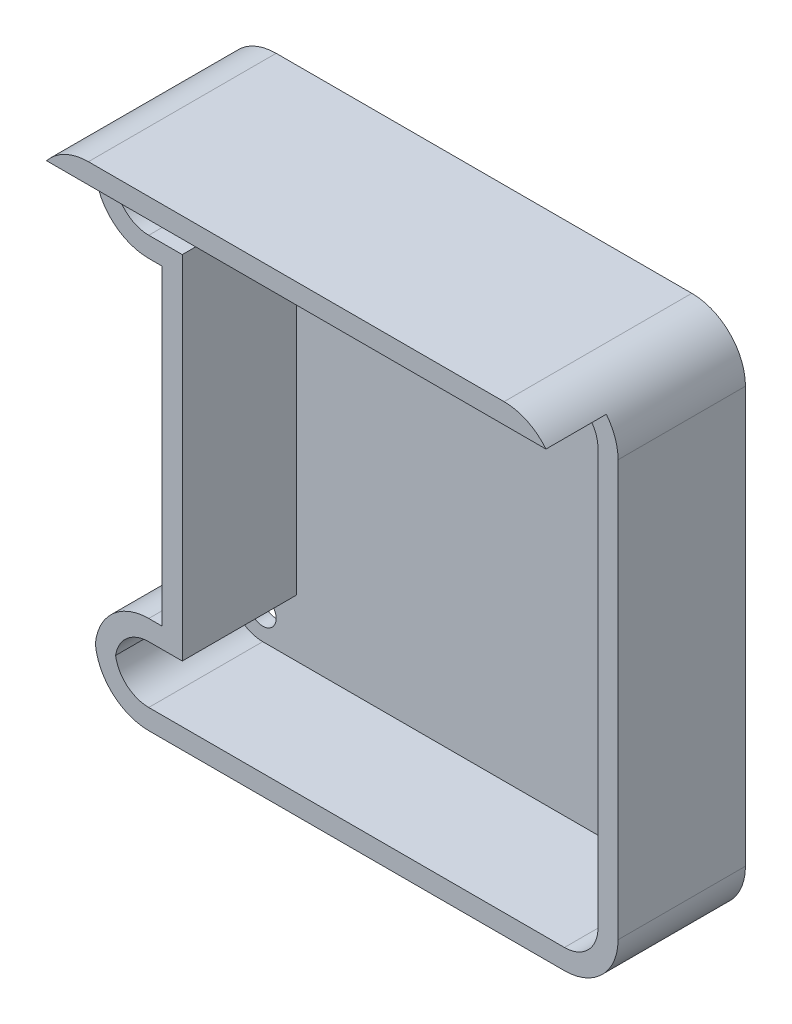
ISO-10303-21;
HEADER;
FILE_DESCRIPTION(('STEP AP214'),'2;1');
FILE_NAME('part.step','',(''),(''),'','','');
FILE_SCHEMA(('AUTOMOTIVE_DESIGN { 1 0 10303 214 1 1 1 1 }'));
ENDSEC;
DATA;
#1=APPLICATION_CONTEXT('core data for automotive mechanical design processes');
#2=APPLICATION_PROTOCOL_DEFINITION('international standard','automotive_design',2000,#1);
#3=PRODUCT_CONTEXT('',#1,'mechanical');
#4=PRODUCT('Part','Part','',(#3));
#5=PRODUCT_RELATED_PRODUCT_CATEGORY('part','',(#4));
#6=PRODUCT_DEFINITION_FORMATION('','',#4);
#7=PRODUCT_DEFINITION_CONTEXT('part definition',#1,'design');
#8=PRODUCT_DEFINITION('design','',#6,#7);
#9=PRODUCT_DEFINITION_SHAPE('','',#8);
#10=(LENGTH_UNIT() NAMED_UNIT(*) SI_UNIT(.MILLI.,.METRE.));
#11=(NAMED_UNIT(*) PLANE_ANGLE_UNIT() SI_UNIT($,.RADIAN.));
#12=(NAMED_UNIT(*) SI_UNIT($,.STERADIAN.) SOLID_ANGLE_UNIT());
#13=UNCERTAINTY_MEASURE_WITH_UNIT(LENGTH_MEASURE(1.E-05),#10,'distance_accuracy_value','');
#14=(GEOMETRIC_REPRESENTATION_CONTEXT(3) GLOBAL_UNCERTAINTY_ASSIGNED_CONTEXT((#13)) GLOBAL_UNIT_ASSIGNED_CONTEXT((#10,
#11,#12)) REPRESENTATION_CONTEXT('',''));
#15=CARTESIAN_POINT('',(0.,0.,0.));
#16=DIRECTION('',(0.,0.,1.));
#17=DIRECTION('',(1.,0.,0.));
#18=AXIS2_PLACEMENT_3D('',#15,#16,#17);
#19=CARTESIAN_POINT('',(-78.,0.,19.));
#20=DIRECTION('',(-1.,0.,0.));
#21=DIRECTION('',(0.,0.,1.));
#22=AXIS2_PLACEMENT_3D('',#19,#20,#21);
#23=PLANE('',#22);
#24=DIRECTION('',(0.,1.,0.));
#25=VECTOR('',#24,1.);
#26=CARTESIAN_POINT('',(-78.,0.,0.));
#27=LINE('',#26,#25);
#28=CARTESIAN_POINT('',(-78.,69.,0.));
#29=VERTEX_POINT('',#28);
#30=CARTESIAN_POINT('',(-78.,70.,0.));
#31=VERTEX_POINT('',#30);
#32=EDGE_CURVE('E465',#29,#31,#27,.T.);
#33=ORIENTED_EDGE('',*,*,#32,.F.);
#34=DIRECTION('',(0.,0.,-1.));
#35=VECTOR('',#34,1.);
#36=CARTESIAN_POINT('',(-78.,69.,19.));
#37=LINE('',#36,#35);
#38=CARTESIAN_POINT('',(-78.,69.,19.));
#39=VERTEX_POINT('',#38);
#40=EDGE_CURVE('E386',#29,#39,#37,.F.);
#41=ORIENTED_EDGE('',*,*,#40,.T.);
#42=DIRECTION('',(0.,1.,0.));
#43=VECTOR('',#42,1.);
#44=CARTESIAN_POINT('',(-78.,0.,19.));
#45=LINE('',#44,#43);
#46=CARTESIAN_POINT('',(-78.,70.,19.));
#47=VERTEX_POINT('',#46);
#48=EDGE_CURVE('E484',#39,#47,#45,.T.);
#49=ORIENTED_EDGE('',*,*,#48,.T.);
#50=DIRECTION('',(0.,0.,-1.));
#51=VECTOR('',#50,1.);
#52=CARTESIAN_POINT('',(-78.,70.,0.));
#53=LINE('',#52,#51);
#54=EDGE_CURVE('E382',#47,#31,#53,.T.);
#55=ORIENTED_EDGE('',*,*,#54,.T.);
#56=EDGE_LOOP('',(#33,#41,#49,#55));
#57=FACE_BOUND('',#56,.T.);
#58=ADVANCED_FACE('F41',(#57),#23,.T.);
#59=CARTESIAN_POINT('',(0.,61.,19.));
#60=DIRECTION('',(0.,1.,0.));
#61=DIRECTION('',(0.,0.,1.));
#62=AXIS2_PLACEMENT_3D('',#59,#60,#61);
#63=PLANE('',#62);
#64=DIRECTION('',(1.,0.,0.));
#65=VECTOR('',#64,1.);
#66=CARTESIAN_POINT('',(0.,61.,19.));
#67=LINE('',#66,#65);
#68=CARTESIAN_POINT('',(-70.,61.,19.));
#69=VERTEX_POINT('',#68);
#70=CARTESIAN_POINT('',(-68.,61.,19.));
#71=VERTEX_POINT('',#70);
#72=EDGE_CURVE('E489',#69,#71,#67,.T.);
#73=ORIENTED_EDGE('',*,*,#72,.F.);
#74=DIRECTION('',(0.,0.,-1.));
#75=VECTOR('',#74,1.);
#76=CARTESIAN_POINT('',(-70.,61.,0.));
#77=LINE('',#76,#75);
#78=CARTESIAN_POINT('',(-70.,61.,0.));
#79=VERTEX_POINT('',#78);
#80=EDGE_CURVE('E378',#69,#79,#77,.T.);
#81=ORIENTED_EDGE('',*,*,#80,.T.);
#82=DIRECTION('',(1.,0.,0.));
#83=VECTOR('',#82,1.);
#84=CARTESIAN_POINT('',(0.,61.,0.));
#85=LINE('',#84,#83);
#86=CARTESIAN_POINT('',(-68.,61.,0.));
#87=VERTEX_POINT('',#86);
#88=EDGE_CURVE('E526',#79,#87,#85,.T.);
#89=ORIENTED_EDGE('',*,*,#88,.T.);
#90=DIRECTION('',(0.,0.,-1.));
#91=VECTOR('',#90,1.);
#92=CARTESIAN_POINT('',(-68.,61.,19.));
#93=LINE('',#92,#91);
#94=EDGE_CURVE('E270',#71,#87,#93,.T.);
#95=ORIENTED_EDGE('',*,*,#94,.F.);
#96=EDGE_LOOP('',(#73,#81,#89,#95));
#97=FACE_BOUND('',#96,.T.);
#98=ADVANCED_FACE('F594',(#97),#63,.F.);
#99=CARTESIAN_POINT('',(-68.,0.,19.));
#100=DIRECTION('',(1.,0.,0.));
#101=DIRECTION('',(0.,0.,-1.));
#102=AXIS2_PLACEMENT_3D('',#99,#100,#101);
#103=PLANE('',#102);
#104=DIRECTION('',(0.,-1.,0.));
#105=VECTOR('',#104,1.);
#106=CARTESIAN_POINT('',(-68.,0.,0.));
#107=LINE('',#106,#105);
#108=CARTESIAN_POINT('',(-68.,14.5,0.));
#109=VERTEX_POINT('',#108);
#110=EDGE_CURVE('E529',#87,#109,#107,.T.);
#111=ORIENTED_EDGE('',*,*,#110,.T.);
#112=DIRECTION('',(0.,0.,-1.));
#113=VECTOR('',#112,1.);
#114=CARTESIAN_POINT('',(-68.,14.5,19.));
#115=LINE('',#114,#113);
#116=CARTESIAN_POINT('',(-68.,14.5,19.));
#117=VERTEX_POINT('',#116);
#118=EDGE_CURVE('E260',#117,#109,#115,.T.);
#119=ORIENTED_EDGE('',*,*,#118,.F.);
#120=DIRECTION('',(0.,-1.,0.));
#121=VECTOR('',#120,1.);
#122=CARTESIAN_POINT('',(-68.,0.,19.));
#123=LINE('',#122,#121);
#124=EDGE_CURVE('E492',#71,#117,#123,.T.);
#125=ORIENTED_EDGE('',*,*,#124,.F.);
#126=ORIENTED_EDGE('',*,*,#94,.T.);
#127=EDGE_LOOP('',(#111,#119,#125,#126));
#128=FACE_BOUND('',#127,.T.);
#129=ADVANCED_FACE('F600',(#128),#103,.F.);
#130=CARTESIAN_POINT('',(0.,14.5,19.));
#131=DIRECTION('',(0.,-1.,0.));
#132=DIRECTION('',(1.,0.,0.));
#133=AXIS2_PLACEMENT_3D('',#130,#131,#132);
#134=PLANE('',#133);
#135=DIRECTION('',(-1.,0.,0.));
#136=VECTOR('',#135,1.);
#137=CARTESIAN_POINT('',(0.,14.5,0.));
#138=LINE('',#137,#136);
#139=CARTESIAN_POINT('',(-70.,14.5,0.));
#140=VERTEX_POINT('',#139);
#141=EDGE_CURVE('E532',#109,#140,#138,.T.);
#142=ORIENTED_EDGE('',*,*,#141,.T.);
#143=DIRECTION('',(0.,0.,-1.));
#144=VECTOR('',#143,1.);
#145=CARTESIAN_POINT('',(-70.,14.5,19.));
#146=LINE('',#145,#144);
#147=CARTESIAN_POINT('',(-70.,14.5,19.));
#148=VERTEX_POINT('',#147);
#149=EDGE_CURVE('E375',#140,#148,#146,.F.);
#150=ORIENTED_EDGE('',*,*,#149,.T.);
#151=DIRECTION('',(-1.,0.,0.));
#152=VECTOR('',#151,1.);
#153=CARTESIAN_POINT('',(0.,14.5,19.));
#154=LINE('',#153,#152);
#155=EDGE_CURVE('E495',#117,#148,#154,.T.);
#156=ORIENTED_EDGE('',*,*,#155,.F.);
#157=ORIENTED_EDGE('',*,*,#118,.T.);
#158=EDGE_LOOP('',(#142,#150,#156,#157));
#159=FACE_BOUND('',#158,.T.);
#160=ADVANCED_FACE('F608',(#159),#134,.F.);
#161=CARTESIAN_POINT('',(0.,0.,19.));
#162=DIRECTION('',(0.,-1.,0.));
#163=DIRECTION('',(1.,0.,0.));
#164=AXIS2_PLACEMENT_3D('',#161,#162,#163);
#165=PLANE('',#164);
#166=DIRECTION('',(-1.,0.,0.));
#167=VECTOR('',#166,1.);
#168=CARTESIAN_POINT('',(0.,0.,0.));
#169=LINE('',#168,#167);
#170=CARTESIAN_POINT('',(-8.,0.,0.));
#171=VERTEX_POINT('',#170);
#172=CARTESIAN_POINT('',(-70.,0.,0.));
#173=VERTEX_POINT('',#172);
#174=EDGE_CURVE('E535',#171,#173,#169,.T.);
#175=ORIENTED_EDGE('',*,*,#174,.F.);
#176=DIRECTION('',(0.,0.,-1.));
#177=VECTOR('',#176,1.);
#178=CARTESIAN_POINT('',(-8.,0.,19.));
#179=LINE('',#178,#177);
#180=CARTESIAN_POINT('',(-8.,0.,19.));
#181=VERTEX_POINT('',#180);
#182=EDGE_CURVE('E354',#171,#181,#179,.F.);
#183=ORIENTED_EDGE('',*,*,#182,.T.);
#184=DIRECTION('',(-1.,0.,0.));
#185=VECTOR('',#184,1.);
#186=CARTESIAN_POINT('',(0.,0.,19.));
#187=LINE('',#186,#185);
#188=CARTESIAN_POINT('',(-70.,0.,19.));
#189=VERTEX_POINT('',#188);
#190=EDGE_CURVE('E499',#181,#189,#187,.T.);
#191=ORIENTED_EDGE('',*,*,#190,.T.);
#192=DIRECTION('',(0.,0.,-1.));
#193=VECTOR('',#192,1.);
#194=CARTESIAN_POINT('',(-70.,0.,19.));
#195=LINE('',#194,#193);
#196=EDGE_CURVE('E350',#189,#173,#195,.T.);
#197=ORIENTED_EDGE('',*,*,#196,.T.);
#198=EDGE_LOOP('',(#175,#183,#191,#197));
#199=FACE_BOUND('',#198,.T.);
#200=ADVANCED_FACE('F606',(#199),#165,.T.);
#201=CARTESIAN_POINT('',(0.,0.,19.));
#202=DIRECTION('',(-1.,0.,0.));
#203=DIRECTION('',(0.,0.,1.));
#204=AXIS2_PLACEMENT_3D('',#201,#202,#203);
#205=PLANE('',#204);
#206=DIRECTION('',(0.,1.,0.));
#207=VECTOR('',#206,1.);
#208=CARTESIAN_POINT('',(0.,0.,19.));
#209=LINE('',#208,#207);
#210=CARTESIAN_POINT('',(0.,8.,19.));
#211=VERTEX_POINT('',#210);
#212=CARTESIAN_POINT('',(0.,70.,19.));
#213=VERTEX_POINT('',#212);
#214=EDGE_CURVE('E503',#211,#213,#209,.T.);
#215=ORIENTED_EDGE('',*,*,#214,.F.);
#216=DIRECTION('',(0.,0.,-1.));
#217=VECTOR('',#216,1.);
#218=CARTESIAN_POINT('',(0.,8.,0.));
#219=LINE('',#218,#217);
#220=CARTESIAN_POINT('',(0.,8.,0.));
#221=VERTEX_POINT('',#220);
#222=EDGE_CURVE('E328',#211,#221,#219,.T.);
#223=ORIENTED_EDGE('',*,*,#222,.T.);
#224=DIRECTION('',(0.,1.,0.));
#225=VECTOR('',#224,1.);
#226=CARTESIAN_POINT('',(0.,0.,0.));
#227=LINE('',#226,#225);
#228=CARTESIAN_POINT('',(0.,70.,0.));
#229=VERTEX_POINT('',#228);
#230=EDGE_CURVE('E264',#221,#229,#227,.T.);
#231=ORIENTED_EDGE('',*,*,#230,.T.);
#232=DIRECTION('',(0.,0.,-1.));
#233=VECTOR('',#232,1.);
#234=CARTESIAN_POINT('',(0.,70.,19.));
#235=LINE('',#234,#233);
#236=EDGE_CURVE('E319',#229,#213,#235,.F.);
#237=ORIENTED_EDGE('',*,*,#236,.T.);
#238=EDGE_LOOP('',(#215,#223,#231,#237));
#239=FACE_BOUND('',#238,.T.);
#240=ADVANCED_FACE('F546',(#239),#205,.F.);
#241=CARTESIAN_POINT('',(-3.,0.,19.));
#242=DIRECTION('',(-1.,0.,0.));
#243=DIRECTION('',(0.,-1.,0.));
#244=AXIS2_PLACEMENT_3D('',#241,#242,#243);
#245=PLANE('',#244);
#246=DIRECTION('',(0.,1.,0.));
#247=VECTOR('',#246,1.);
#248=CARTESIAN_POINT('',(-3.,0.,19.));
#249=LINE('',#248,#247);
#250=CARTESIAN_POINT('',(-3.,7.99999999999999,19.));
#251=VERTEX_POINT('',#250);
#252=CARTESIAN_POINT('',(-3.,70.,19.));
#253=VERTEX_POINT('',#252);
#254=EDGE_CURVE('E507',#251,#253,#249,.T.);
#255=ORIENTED_EDGE('',*,*,#254,.T.);
#256=DIRECTION('',(0.,0.,-1.));
#257=VECTOR('',#256,1.);
#258=CARTESIAN_POINT('',(-3.,70.,19.));
#259=LINE('',#258,#257);
#260=CARTESIAN_POINT('',(-3.,70.,2.));
#261=VERTEX_POINT('',#260);
#262=EDGE_CURVE('E429',#253,#261,#259,.T.);
#263=ORIENTED_EDGE('',*,*,#262,.T.);
#264=DIRECTION('',(0.,1.,0.));
#265=VECTOR('',#264,1.);
#266=CARTESIAN_POINT('',(-3.,0.,2.));
#267=LINE('',#266,#265);
#268=CARTESIAN_POINT('',(-3.,7.99999999999999,2.));
#269=VERTEX_POINT('',#268);
#270=EDGE_CURVE('E450',#269,#261,#267,.T.);
#271=ORIENTED_EDGE('',*,*,#270,.F.);
#272=DIRECTION('',(0.,0.,-1.));
#273=VECTOR('',#272,1.);
#274=CARTESIAN_POINT('',(-3.,7.99999999999999,19.));
#275=LINE('',#274,#273);
#276=EDGE_CURVE('E303',#269,#251,#275,.F.);
#277=ORIENTED_EDGE('',*,*,#276,.T.);
#278=EDGE_LOOP('',(#255,#263,#271,#277));
#279=FACE_BOUND('',#278,.T.);
#280=ADVANCED_FACE('F562',(#279),#245,.T.);
#281=CARTESIAN_POINT('',(0.,2.99999999999999,19.));
#282=DIRECTION('',(0.,1.,0.));
#283=DIRECTION('',(0.,0.,1.));
#284=AXIS2_PLACEMENT_3D('',#281,#282,#283);
#285=PLANE('',#284);
#286=DIRECTION('',(1.,0.,0.));
#287=VECTOR('',#286,1.);
#288=CARTESIAN_POINT('',(0.,2.99999999999999,2.));
#289=LINE('',#288,#287);
#290=CARTESIAN_POINT('',(-70.,2.99999999999999,2.));
#291=VERTEX_POINT('',#290);
#292=CARTESIAN_POINT('',(-8.,2.99999999999999,2.));
#293=VERTEX_POINT('',#292);
#294=EDGE_CURVE('E461',#291,#293,#289,.T.);
#295=ORIENTED_EDGE('',*,*,#294,.F.);
#296=DIRECTION('',(0.,0.,-1.));
#297=VECTOR('',#296,1.);
#298=CARTESIAN_POINT('',(-70.,2.99999999999999,19.));
#299=LINE('',#298,#297);
#300=CARTESIAN_POINT('',(-70.,2.99999999999999,19.));
#301=VERTEX_POINT('',#300);
#302=EDGE_CURVE('E300',#291,#301,#299,.F.);
#303=ORIENTED_EDGE('',*,*,#302,.T.);
#304=DIRECTION('',(1.,0.,0.));
#305=VECTOR('',#304,1.);
#306=CARTESIAN_POINT('',(0.,2.99999999999999,19.));
#307=LINE('',#306,#305);
#308=CARTESIAN_POINT('',(-8.,2.99999999999999,19.));
#309=VERTEX_POINT('',#308);
#310=EDGE_CURVE('E510',#301,#309,#307,.T.);
#311=ORIENTED_EDGE('',*,*,#310,.T.);
#312=DIRECTION('',(0.,0.,-1.));
#313=VECTOR('',#312,1.);
#314=CARTESIAN_POINT('',(-8.,2.99999999999999,2.));
#315=LINE('',#314,#313);
#316=EDGE_CURVE('E296',#309,#293,#315,.T.);
#317=ORIENTED_EDGE('',*,*,#316,.T.);
#318=EDGE_LOOP('',(#295,#303,#311,#317));
#319=FACE_BOUND('',#318,.T.);
#320=ADVANCED_FACE('F570',(#319),#285,.T.);
#321=CARTESIAN_POINT('',(0.,11.5,19.));
#322=DIRECTION('',(0.,-1.,0.));
#323=DIRECTION('',(1.,0.,0.));
#324=AXIS2_PLACEMENT_3D('',#321,#322,#323);
#325=PLANE('',#324);
#326=DIRECTION('',(-1.,0.,0.));
#327=VECTOR('',#326,1.);
#328=CARTESIAN_POINT('',(0.,11.5,19.));
#329=LINE('',#328,#327);
#330=CARTESIAN_POINT('',(-65.,11.5,19.));
#331=VERTEX_POINT('',#330);
#332=CARTESIAN_POINT('',(-70.,11.5,19.));
#333=VERTEX_POINT('',#332);
#334=EDGE_CURVE('E514',#331,#333,#329,.T.);
#335=ORIENTED_EDGE('',*,*,#334,.T.);
#336=DIRECTION('',(0.,0.,-1.));
#337=VECTOR('',#336,1.);
#338=CARTESIAN_POINT('',(-70.,11.5,2.));
#339=LINE('',#338,#337);
#340=CARTESIAN_POINT('',(-70.,11.5,2.));
#341=VERTEX_POINT('',#340);
#342=EDGE_CURVE('E292',#333,#341,#339,.T.);
#343=ORIENTED_EDGE('',*,*,#342,.T.);
#344=DIRECTION('',(-1.,0.,0.));
#345=VECTOR('',#344,1.);
#346=CARTESIAN_POINT('',(0.,11.5,2.));
#347=LINE('',#346,#345);
#348=CARTESIAN_POINT('',(-65.,11.5,2.));
#349=VERTEX_POINT('',#348);
#350=EDGE_CURVE('E250',#349,#341,#347,.T.);
#351=ORIENTED_EDGE('',*,*,#350,.F.);
#352=DIRECTION('',(0.,0.,-1.));
#353=VECTOR('',#352,1.);
#354=CARTESIAN_POINT('',(-65.,11.5,19.));
#355=LINE('',#354,#353);
#356=EDGE_CURVE('E248',#331,#349,#355,.T.);
#357=ORIENTED_EDGE('',*,*,#356,.F.);
#358=EDGE_LOOP('',(#335,#343,#351,#357));
#359=FACE_BOUND('',#358,.T.);
#360=ADVANCED_FACE('F584',(#359),#325,.T.);
#361=CARTESIAN_POINT('',(-65.,0.,19.));
#362=DIRECTION('',(1.,0.,0.));
#363=DIRECTION('',(0.,0.,-1.));
#364=AXIS2_PLACEMENT_3D('',#361,#362,#363);
#365=PLANE('',#364);
#366=DIRECTION('',(0.,-1.,0.));
#367=VECTOR('',#366,1.);
#368=CARTESIAN_POINT('',(-65.,0.,2.));
#369=LINE('',#368,#367);
#370=CARTESIAN_POINT('',(-65.,64.,2.));
#371=VERTEX_POINT('',#370);
#372=EDGE_CURVE('E231',#371,#349,#369,.T.);
#373=ORIENTED_EDGE('',*,*,#372,.F.);
#374=DIRECTION('',(0.,0.,-1.));
#375=VECTOR('',#374,1.);
#376=CARTESIAN_POINT('',(-65.,64.,19.));
#377=LINE('',#376,#375);
#378=CARTESIAN_POINT('',(-65.,64.,19.));
#379=VERTEX_POINT('',#378);
#380=EDGE_CURVE('E246',#379,#371,#377,.T.);
#381=ORIENTED_EDGE('',*,*,#380,.F.);
#382=DIRECTION('',(0.,-1.,0.));
#383=VECTOR('',#382,1.);
#384=CARTESIAN_POINT('',(-65.,0.,19.));
#385=LINE('',#384,#383);
#386=EDGE_CURVE('E518',#379,#331,#385,.T.);
#387=ORIENTED_EDGE('',*,*,#386,.T.);
#388=ORIENTED_EDGE('',*,*,#356,.T.);
#389=EDGE_LOOP('',(#373,#381,#387,#388));
#390=FACE_BOUND('',#389,.T.);
#391=ADVANCED_FACE('F244',(#390),#365,.T.);
#392=CARTESIAN_POINT('',(0.,64.,19.));
#393=DIRECTION('',(0.,1.,0.));
#394=DIRECTION('',(0.,0.,1.));
#395=AXIS2_PLACEMENT_3D('',#392,#393,#394);
#396=PLANE('',#395);
#397=DIRECTION('',(1.,0.,0.));
#398=VECTOR('',#397,1.);
#399=CARTESIAN_POINT('',(0.,64.,2.));
#400=LINE('',#399,#398);
#401=CARTESIAN_POINT('',(-70.,64.,2.));
#402=VERTEX_POINT('',#401);
#403=EDGE_CURVE('E226',#402,#371,#400,.T.);
#404=ORIENTED_EDGE('',*,*,#403,.F.);
#405=DIRECTION('',(0.,0.,-1.));
#406=VECTOR('',#405,1.);
#407=CARTESIAN_POINT('',(-70.,64.,19.));
#408=LINE('',#407,#406);
#409=CARTESIAN_POINT('',(-70.,64.,19.));
#410=VERTEX_POINT('',#409);
#411=EDGE_CURVE('E289',#402,#410,#408,.F.);
#412=ORIENTED_EDGE('',*,*,#411,.T.);
#413=DIRECTION('',(1.,0.,0.));
#414=VECTOR('',#413,1.);
#415=CARTESIAN_POINT('',(0.,64.,19.));
#416=LINE('',#415,#414);
#417=EDGE_CURVE('E254',#410,#379,#416,.T.);
#418=ORIENTED_EDGE('',*,*,#417,.T.);
#419=ORIENTED_EDGE('',*,*,#380,.T.);
#420=EDGE_LOOP('',(#404,#412,#418,#419));
#421=FACE_BOUND('',#420,.T.);
#422=ADVANCED_FACE('F252',(#421),#396,.T.);
#423=CARTESIAN_POINT('',(-75.,0.,19.));
#424=DIRECTION('',(1.,0.,0.));
#425=DIRECTION('',(0.,0.,-1.));
#426=AXIS2_PLACEMENT_3D('',#423,#424,#425);
#427=PLANE('',#426);
#428=DIRECTION('',(0.,-1.,0.));
#429=VECTOR('',#428,1.);
#430=CARTESIAN_POINT('',(-75.,0.,2.));
#431=LINE('',#430,#429);
#432=CARTESIAN_POINT('',(-75.,70.,2.));
#433=VERTEX_POINT('',#432);
#434=CARTESIAN_POINT('',(-75.,69.,2.));
#435=VERTEX_POINT('',#434);
#436=EDGE_CURVE('E239',#433,#435,#431,.T.);
#437=ORIENTED_EDGE('',*,*,#436,.F.);
#438=DIRECTION('',(0.,0.,-1.));
#439=VECTOR('',#438,1.);
#440=CARTESIAN_POINT('',(-75.,70.,19.));
#441=LINE('',#440,#439);
#442=CARTESIAN_POINT('',(-75.,70.,19.));
#443=VERTEX_POINT('',#442);
#444=EDGE_CURVE('E63',#433,#443,#441,.F.);
#445=ORIENTED_EDGE('',*,*,#444,.T.);
#446=DIRECTION('',(0.,-1.,0.));
#447=VECTOR('',#446,1.);
#448=CARTESIAN_POINT('',(-75.,0.,19.));
#449=LINE('',#448,#447);
#450=CARTESIAN_POINT('',(-75.,69.,19.));
#451=VERTEX_POINT('',#450);
#452=EDGE_CURVE('E256',#443,#451,#449,.T.);
#453=ORIENTED_EDGE('',*,*,#452,.T.);
#454=DIRECTION('',(0.,0.,-1.));
#455=VECTOR('',#454,1.);
#456=CARTESIAN_POINT('',(-75.,69.,2.));
#457=LINE('',#456,#455);
#458=EDGE_CURVE('E274',#451,#435,#457,.T.);
#459=ORIENTED_EDGE('',*,*,#458,.T.);
#460=EDGE_LOOP('',(#437,#445,#453,#459));
#461=FACE_BOUND('',#460,.T.);
#462=ADVANCED_FACE('F693',(#461),#427,.T.);
#463=CARTESIAN_POINT('',(0.,0.,19.));
#464=DIRECTION('',(0.,0.,1.));
#465=DIRECTION('',(1.,0.,0.));
#466=AXIS2_PLACEMENT_3D('',#463,#464,#465);
#467=PLANE('',#466);
#468=ORIENTED_EDGE('',*,*,#190,.F.);
#469=CARTESIAN_POINT('',(-8.,8.,19.));
#470=DIRECTION('',(0.,0.,1.));
#471=DIRECTION('',(1.,0.,0.));
#472=AXIS2_PLACEMENT_3D('',#469,#470,#471);
#473=CIRCLE('',#472,8.);
#474=EDGE_CURVE('E372',#181,#211,#473,.T.);
#475=ORIENTED_EDGE('',*,*,#474,.T.);
#476=ORIENTED_EDGE('',*,*,#214,.T.);
#477=CARTESIAN_POINT('',(-8.,70.,19.));
#478=DIRECTION('',(0.,0.,1.));
#479=DIRECTION('',(1.,0.,0.));
#480=AXIS2_PLACEMENT_3D('',#477,#478,#479);
#481=CIRCLE('',#480,8.);
#482=CARTESIAN_POINT('',(-1.75500200160159,75.,19.));
#483=VERTEX_POINT('',#482);
#484=EDGE_CURVE('E357',#213,#483,#481,.T.);
#485=ORIENTED_EDGE('',*,*,#484,.T.);
#486=DIRECTION('',(1.,0.,0.));
#487=VECTOR('',#486,1.);
#488=CARTESIAN_POINT('',(0.,75.,19.));
#489=LINE('',#488,#487);
#490=CARTESIAN_POINT('',(-8.,75.,19.));
#491=VERTEX_POINT('',#490);
#492=EDGE_CURVE('E485',#491,#483,#489,.T.);
#493=ORIENTED_EDGE('',*,*,#492,.F.);
#494=CARTESIAN_POINT('',(-8.,70.,19.));
#495=DIRECTION('',(0.,0.,1.));
#496=DIRECTION('',(1.,0.,0.));
#497=AXIS2_PLACEMENT_3D('',#494,#495,#496);
#498=CIRCLE('',#497,5.);
#499=EDGE_CURVE('E11',#491,#253,#498,.F.);
#500=ORIENTED_EDGE('',*,*,#499,.T.);
#501=ORIENTED_EDGE('',*,*,#254,.F.);
#502=CARTESIAN_POINT('',(-8.,7.99999999999999,19.));
#503=DIRECTION('',(0.,0.,1.));
#504=DIRECTION('',(1.,0.,0.));
#505=AXIS2_PLACEMENT_3D('',#502,#503,#504);
#506=CIRCLE('',#505,5.);
#507=EDGE_CURVE('E316',#251,#309,#506,.F.);
#508=ORIENTED_EDGE('',*,*,#507,.T.);
#509=ORIENTED_EDGE('',*,*,#310,.F.);
#510=CARTESIAN_POINT('',(-70.,7.99999999999999,19.));
#511=DIRECTION('',(0.,0.,1.));
#512=DIRECTION('',(1.,0.,0.));
#513=AXIS2_PLACEMENT_3D('',#510,#511,#512);
#514=CIRCLE('',#513,5.);
#515=CARTESIAN_POINT('',(-74.9434299833213,7.24999999999999,19.));
#516=VERTEX_POINT('',#515);
#517=EDGE_CURVE('E313',#301,#516,#514,.F.);
#518=ORIENTED_EDGE('',*,*,#517,.T.);
#519=CARTESIAN_POINT('',(-70.,6.49999999999999,19.));
#520=DIRECTION('',(0.,0.,1.));
#521=DIRECTION('',(1.,0.,0.));
#522=AXIS2_PLACEMENT_3D('',#519,#520,#521);
#523=CIRCLE('',#522,5.);
#524=EDGE_CURVE('E310',#516,#333,#523,.F.);
#525=ORIENTED_EDGE('',*,*,#524,.T.);
#526=ORIENTED_EDGE('',*,*,#334,.F.);
#527=ORIENTED_EDGE('',*,*,#386,.F.);
#528=ORIENTED_EDGE('',*,*,#417,.F.);
#529=CARTESIAN_POINT('',(-70.,69.,19.));
#530=DIRECTION('',(0.,0.,1.));
#531=DIRECTION('',(1.,0.,0.));
#532=AXIS2_PLACEMENT_3D('',#529,#530,#531);
#533=CIRCLE('',#532,5.);
#534=EDGE_CURVE('E306',#410,#451,#533,.F.);
#535=ORIENTED_EDGE('',*,*,#534,.T.);
#536=ORIENTED_EDGE('',*,*,#452,.F.);
#537=CARTESIAN_POINT('',(-70.,70.,19.));
#538=DIRECTION('',(0.,0.,1.));
#539=DIRECTION('',(1.,0.,0.));
#540=AXIS2_PLACEMENT_3D('',#537,#538,#539);
#541=CIRCLE('',#540,5.);
#542=CARTESIAN_POINT('',(-70.,75.,19.));
#543=VERTEX_POINT('',#542);
#544=EDGE_CURVE('E50',#443,#543,#541,.F.);
#545=ORIENTED_EDGE('',*,*,#544,.T.);
#546=CARTESIAN_POINT('',(-76.2449979983984,75.,19.));
#547=VERTEX_POINT('',#546);
#548=EDGE_CURVE('E439',#547,#543,#489,.T.);
#549=ORIENTED_EDGE('',*,*,#548,.F.);
#550=CARTESIAN_POINT('',(-70.,70.,19.));
#551=DIRECTION('',(0.,0.,1.));
#552=DIRECTION('',(1.,0.,0.));
#553=AXIS2_PLACEMENT_3D('',#550,#551,#552);
#554=CIRCLE('',#553,8.);
#555=EDGE_CURVE('E360',#547,#47,#554,.T.);
#556=ORIENTED_EDGE('',*,*,#555,.T.);
#557=ORIENTED_EDGE('',*,*,#48,.F.);
#558=CARTESIAN_POINT('',(-70.,69.,19.));
#559=DIRECTION('',(0.,0.,1.));
#560=DIRECTION('',(1.,0.,0.));
#561=AXIS2_PLACEMENT_3D('',#558,#559,#560);
#562=CIRCLE('',#561,8.);
#563=EDGE_CURVE('E363',#39,#69,#562,.T.);
#564=ORIENTED_EDGE('',*,*,#563,.T.);
#565=ORIENTED_EDGE('',*,*,#72,.T.);
#566=ORIENTED_EDGE('',*,*,#124,.T.);
#567=ORIENTED_EDGE('',*,*,#155,.T.);
#568=CARTESIAN_POINT('',(-70.,6.49999999999999,19.));
#569=DIRECTION('',(0.,0.,1.));
#570=DIRECTION('',(1.,0.,0.));
#571=AXIS2_PLACEMENT_3D('',#568,#569,#570);
#572=CIRCLE('',#571,8.);
#573=CARTESIAN_POINT('',(-77.964766161037,7.24999999999999,19.));
#574=VERTEX_POINT('',#573);
#575=EDGE_CURVE('E366',#148,#574,#572,.T.);
#576=ORIENTED_EDGE('',*,*,#575,.T.);
#577=CARTESIAN_POINT('',(-70.,7.99999999999999,19.));
#578=DIRECTION('',(0.,0.,1.));
#579=DIRECTION('',(1.,0.,0.));
#580=AXIS2_PLACEMENT_3D('',#577,#578,#579);
#581=CIRCLE('',#580,8.);
#582=EDGE_CURVE('E369',#574,#189,#581,.T.);
#583=ORIENTED_EDGE('',*,*,#582,.T.);
#584=EDGE_LOOP('',(#468,#475,#476,#485,#493,#500,#501,#508,#509,#518,#525,#526,#527,#528,#535,
#536,#545,#549,#556,#557,#564,#565,#566,#567,#576,#583));
#585=FACE_BOUND('',#584,.T.);
#586=ADVANCED_FACE('F438',(#585),#467,.T.);
#587=CARTESIAN_POINT('',(0.,0.,0.));
#588=DIRECTION('',(0.,0.,1.));
#589=DIRECTION('',(1.,0.,0.));
#590=AXIS2_PLACEMENT_3D('',#587,#588,#589);
#591=PLANE('',#590);
#592=ORIENTED_EDGE('',*,*,#230,.F.);
#593=CARTESIAN_POINT('',(-8.,8.,0.));
#594=DIRECTION('',(0.,0.,1.));
#595=DIRECTION('',(1.,0.,0.));
#596=AXIS2_PLACEMENT_3D('',#593,#594,#595);
#597=CIRCLE('',#596,8.);
#598=EDGE_CURVE('E347',#221,#171,#597,.F.);
#599=ORIENTED_EDGE('',*,*,#598,.T.);
#600=ORIENTED_EDGE('',*,*,#174,.T.);
#601=CARTESIAN_POINT('',(-70.,7.99999999999999,0.));
#602=DIRECTION('',(0.,0.,1.));
#603=DIRECTION('',(1.,0.,0.));
#604=AXIS2_PLACEMENT_3D('',#601,#602,#603);
#605=CIRCLE('',#604,8.);
#606=CARTESIAN_POINT('',(-77.964766161037,7.24999999999999,0.));
#607=VERTEX_POINT('',#606);
#608=EDGE_CURVE('E344',#173,#607,#605,.F.);
#609=ORIENTED_EDGE('',*,*,#608,.T.);
#610=CARTESIAN_POINT('',(-70.,6.49999999999999,0.));
#611=DIRECTION('',(0.,0.,1.));
#612=DIRECTION('',(1.,0.,0.));
#613=AXIS2_PLACEMENT_3D('',#610,#611,#612);
#614=CIRCLE('',#613,8.);
#615=EDGE_CURVE('E341',#607,#140,#614,.F.);
#616=ORIENTED_EDGE('',*,*,#615,.T.);
#617=ORIENTED_EDGE('',*,*,#141,.F.);
#618=ORIENTED_EDGE('',*,*,#110,.F.);
#619=ORIENTED_EDGE('',*,*,#88,.F.);
#620=CARTESIAN_POINT('',(-70.,69.,0.));
#621=DIRECTION('',(0.,0.,1.));
#622=DIRECTION('',(1.,0.,0.));
#623=AXIS2_PLACEMENT_3D('',#620,#621,#622);
#624=CIRCLE('',#623,8.);
#625=EDGE_CURVE('E338',#79,#29,#624,.F.);
#626=ORIENTED_EDGE('',*,*,#625,.T.);
#627=ORIENTED_EDGE('',*,*,#32,.T.);
#628=CARTESIAN_POINT('',(-70.,70.,0.));
#629=DIRECTION('',(0.,0.,1.));
#630=DIRECTION('',(1.,0.,0.));
#631=AXIS2_PLACEMENT_3D('',#628,#629,#630);
#632=CIRCLE('',#631,8.);
#633=CARTESIAN_POINT('',(-70.,78.,0.));
#634=VERTEX_POINT('',#633);
#635=EDGE_CURVE('E335',#31,#634,#632,.F.);
#636=ORIENTED_EDGE('',*,*,#635,.T.);
#637=DIRECTION('',(-1.,0.,0.));
#638=VECTOR('',#637,1.);
#639=CARTESIAN_POINT('',(0.,78.,0.));
#640=LINE('',#639,#638);
#641=CARTESIAN_POINT('',(-8.,78.,0.));
#642=VERTEX_POINT('',#641);
#643=EDGE_CURVE('E413',#642,#634,#640,.T.);
#644=ORIENTED_EDGE('',*,*,#643,.F.);
#645=CARTESIAN_POINT('',(-8.,70.,0.));
#646=DIRECTION('',(0.,0.,1.));
#647=DIRECTION('',(1.,0.,0.));
#648=AXIS2_PLACEMENT_3D('',#645,#646,#647);
#649=CIRCLE('',#648,8.);
#650=EDGE_CURVE('E332',#642,#229,#649,.F.);
#651=ORIENTED_EDGE('',*,*,#650,.T.);
#652=EDGE_LOOP('',(#592,#599,#600,#609,#616,#617,#618,#619,#626,#627,#636,#644,#651));
#653=FACE_BOUND('',#652,.T.);
#654=CARTESIAN_POINT('',(-70.,6.99999999999998,0.));
#655=DIRECTION('',(0.,0.,1.));
#656=DIRECTION('',(1.,0.,0.));
#657=AXIS2_PLACEMENT_3D('',#654,#655,#656);
#658=CIRCLE('',#657,2.);
#659=CARTESIAN_POINT('',(-68.,6.99999999999998,0.));
#660=VERTEX_POINT('',#659);
#661=EDGE_CURVE('E324',#660,#660,#658,.T.);
#662=ORIENTED_EDGE('',*,*,#661,.T.);
#663=EDGE_LOOP('',(#662));
#664=FACE_BOUND('',#663,.T.);
#665=CARTESIAN_POINT('',(-8.00000000000001,7.,0.));
#666=DIRECTION('',(0.,0.,1.));
#667=DIRECTION('',(1.,0.,0.));
#668=AXIS2_PLACEMENT_3D('',#665,#666,#667);
#669=CIRCLE('',#668,2.);
#670=CARTESIAN_POINT('',(-6.00000000000001,7.,0.));
#671=VERTEX_POINT('',#670);
#672=EDGE_CURVE('E469',#671,#671,#669,.T.);
#673=ORIENTED_EDGE('',*,*,#672,.T.);
#674=EDGE_LOOP('',(#673));
#675=FACE_BOUND('',#674,.T.);
#676=CARTESIAN_POINT('',(-70.,69.,0.));
#677=DIRECTION('',(0.,0.,1.));
#678=DIRECTION('',(1.,0.,0.));
#679=AXIS2_PLACEMENT_3D('',#676,#677,#678);
#680=CIRCLE('',#679,2.);
#681=CARTESIAN_POINT('',(-68.,69.,0.));
#682=VERTEX_POINT('',#681);
#683=EDGE_CURVE('E473',#682,#682,#680,.T.);
#684=ORIENTED_EDGE('',*,*,#683,.T.);
#685=EDGE_LOOP('',(#684));
#686=FACE_BOUND('',#685,.T.);
#687=CARTESIAN_POINT('',(-8.00000000000001,69.,0.));
#688=DIRECTION('',(0.,0.,1.));
#689=DIRECTION('',(1.,0.,0.));
#690=AXIS2_PLACEMENT_3D('',#687,#688,#689);
#691=CIRCLE('',#690,2.);
#692=CARTESIAN_POINT('',(-6.00000000000001,69.,0.));
#693=VERTEX_POINT('',#692);
#694=EDGE_CURVE('E477',#693,#693,#691,.T.);
#695=ORIENTED_EDGE('',*,*,#694,.T.);
#696=EDGE_LOOP('',(#695));
#697=FACE_BOUND('',#696,.T.);
#698=ADVANCED_FACE('F692',(#653,#664,#675,#686,#697),#591,.F.);
#699=CARTESIAN_POINT('',(-8.00000000000001,69.,2.));
#700=DIRECTION('',(0.,0.,-1.));
#701=DIRECTION('',(-1.,0.,0.));
#702=AXIS2_PLACEMENT_3D('',#699,#700,#701);
#703=CYLINDRICAL_SURFACE('',#702,2.);
#704=CARTESIAN_POINT('',(-8.00000000000001,69.,2.));
#705=DIRECTION('',(0.,0.,1.));
#706=DIRECTION('',(1.,0.,0.));
#707=AXIS2_PLACEMENT_3D('',#704,#705,#706);
#708=CIRCLE('',#707,2.);
#709=CARTESIAN_POINT('',(-6.00000000000001,69.,2.));
#710=VERTEX_POINT('',#709);
#711=EDGE_CURVE('E455',#710,#710,#708,.T.);
#712=ORIENTED_EDGE('',*,*,#711,.T.);
#713=EDGE_LOOP('',(#712));
#714=FACE_BOUND('',#713,.T.);
#715=ORIENTED_EDGE('',*,*,#694,.F.);
#716=EDGE_LOOP('',(#715));
#717=FACE_BOUND('',#716,.T.);
#718=ADVANCED_FACE('F776',(#714,#717),#703,.F.);
#719=CARTESIAN_POINT('',(-70.,69.,2.));
#720=DIRECTION('',(0.,0.,-1.));
#721=DIRECTION('',(-1.,0.,0.));
#722=AXIS2_PLACEMENT_3D('',#719,#720,#721);
#723=CYLINDRICAL_SURFACE('',#722,2.);
#724=CARTESIAN_POINT('',(-70.,69.,2.));
#725=DIRECTION('',(0.,0.,1.));
#726=DIRECTION('',(1.,0.,0.));
#727=AXIS2_PLACEMENT_3D('',#724,#725,#726);
#728=CIRCLE('',#727,2.);
#729=CARTESIAN_POINT('',(-68.,69.,2.));
#730=VERTEX_POINT('',#729);
#731=EDGE_CURVE('E911',#730,#730,#728,.T.);
#732=ORIENTED_EDGE('',*,*,#731,.T.);
#733=EDGE_LOOP('',(#732));
#734=FACE_BOUND('',#733,.T.);
#735=ORIENTED_EDGE('',*,*,#683,.F.);
#736=EDGE_LOOP('',(#735));
#737=FACE_BOUND('',#736,.T.);
#738=ADVANCED_FACE('F868',(#734,#737),#723,.F.);
#739=CARTESIAN_POINT('',(-8.00000000000001,7.,2.));
#740=DIRECTION('',(0.,0.,-1.));
#741=DIRECTION('',(-1.,0.,0.));
#742=AXIS2_PLACEMENT_3D('',#739,#740,#741);
#743=CYLINDRICAL_SURFACE('',#742,2.);
#744=CARTESIAN_POINT('',(-8.00000000000001,7.,2.));
#745=DIRECTION('',(0.,0.,1.));
#746=DIRECTION('',(1.,0.,0.));
#747=AXIS2_PLACEMENT_3D('',#744,#745,#746);
#748=CIRCLE('',#747,2.);
#749=CARTESIAN_POINT('',(-6.00000000000001,7.,2.));
#750=VERTEX_POINT('',#749);
#751=EDGE_CURVE('E914',#750,#750,#748,.T.);
#752=ORIENTED_EDGE('',*,*,#751,.T.);
#753=EDGE_LOOP('',(#752));
#754=FACE_BOUND('',#753,.T.);
#755=ORIENTED_EDGE('',*,*,#672,.F.);
#756=EDGE_LOOP('',(#755));
#757=FACE_BOUND('',#756,.T.);
#758=ADVANCED_FACE('F858',(#754,#757),#743,.F.);
#759=CARTESIAN_POINT('',(-70.,6.99999999999998,2.));
#760=DIRECTION('',(0.,0.,-1.));
#761=DIRECTION('',(-1.,0.,0.));
#762=AXIS2_PLACEMENT_3D('',#759,#760,#761);
#763=CYLINDRICAL_SURFACE('',#762,2.);
#764=CARTESIAN_POINT('',(-70.,6.99999999999998,2.));
#765=DIRECTION('',(0.,0.,1.));
#766=DIRECTION('',(1.,0.,0.));
#767=AXIS2_PLACEMENT_3D('',#764,#765,#766);
#768=CIRCLE('',#767,2.);
#769=CARTESIAN_POINT('',(-68.,6.99999999999998,2.));
#770=VERTEX_POINT('',#769);
#771=EDGE_CURVE('E481',#770,#770,#768,.T.);
#772=ORIENTED_EDGE('',*,*,#771,.T.);
#773=EDGE_LOOP('',(#772));
#774=FACE_BOUND('',#773,.T.);
#775=ORIENTED_EDGE('',*,*,#661,.F.);
#776=EDGE_LOOP('',(#775));
#777=FACE_BOUND('',#776,.T.);
#778=ADVANCED_FACE('F679',(#774,#777),#763,.F.);
#779=CARTESIAN_POINT('',(0.,0.,2.));
#780=DIRECTION('',(0.,0.,1.));
#781=DIRECTION('',(1.,0.,0.));
#782=AXIS2_PLACEMENT_3D('',#779,#780,#781);
#783=PLANE('',#782);
#784=ORIENTED_EDGE('',*,*,#771,.F.);
#785=EDGE_LOOP('',(#784));
#786=FACE_BOUND('',#785,.T.);
#787=ORIENTED_EDGE('',*,*,#751,.F.);
#788=EDGE_LOOP('',(#787));
#789=FACE_BOUND('',#788,.T.);
#790=ORIENTED_EDGE('',*,*,#731,.F.);
#791=EDGE_LOOP('',(#790));
#792=FACE_BOUND('',#791,.T.);
#793=ORIENTED_EDGE('',*,*,#711,.F.);
#794=EDGE_LOOP('',(#793));
#795=FACE_BOUND('',#794,.T.);
#796=DIRECTION('',(-1.,0.,0.));
#797=VECTOR('',#796,1.);
#798=CARTESIAN_POINT('',(0.,75.,2.));
#799=LINE('',#798,#797);
#800=CARTESIAN_POINT('',(-8.,75.,2.));
#801=VERTEX_POINT('',#800);
#802=CARTESIAN_POINT('',(-70.,75.,2.));
#803=VERTEX_POINT('',#802);
#804=EDGE_CURVE('E446',#801,#803,#799,.T.);
#805=ORIENTED_EDGE('',*,*,#804,.T.);
#806=CARTESIAN_POINT('',(-70.,70.,2.));
#807=DIRECTION('',(0.,0.,1.));
#808=DIRECTION('',(1.,0.,0.));
#809=AXIS2_PLACEMENT_3D('',#806,#807,#808);
#810=CIRCLE('',#809,5.);
#811=EDGE_CURVE('E424',#803,#433,#810,.T.);
#812=ORIENTED_EDGE('',*,*,#811,.T.);
#813=ORIENTED_EDGE('',*,*,#436,.T.);
#814=CARTESIAN_POINT('',(-70.,69.,2.));
#815=DIRECTION('',(0.,0.,1.));
#816=DIRECTION('',(1.,0.,0.));
#817=AXIS2_PLACEMENT_3D('',#814,#815,#816);
#818=CIRCLE('',#817,5.);
#819=EDGE_CURVE('E234',#435,#402,#818,.T.);
#820=ORIENTED_EDGE('',*,*,#819,.T.);
#821=ORIENTED_EDGE('',*,*,#403,.T.);
#822=ORIENTED_EDGE('',*,*,#372,.T.);
#823=ORIENTED_EDGE('',*,*,#350,.T.);
#824=CARTESIAN_POINT('',(-70.,6.49999999999999,2.));
#825=DIRECTION('',(0.,0.,1.));
#826=DIRECTION('',(1.,0.,0.));
#827=AXIS2_PLACEMENT_3D('',#824,#825,#826);
#828=CIRCLE('',#827,5.);
#829=CARTESIAN_POINT('',(-74.9434299833213,7.24999999999999,2.));
#830=VERTEX_POINT('',#829);
#831=EDGE_CURVE('E284',#341,#830,#828,.T.);
#832=ORIENTED_EDGE('',*,*,#831,.T.);
#833=CARTESIAN_POINT('',(-70.,7.99999999999999,2.));
#834=DIRECTION('',(0.,0.,1.));
#835=DIRECTION('',(1.,0.,0.));
#836=AXIS2_PLACEMENT_3D('',#833,#834,#835);
#837=CIRCLE('',#836,5.);
#838=EDGE_CURVE('E281',#830,#291,#837,.T.);
#839=ORIENTED_EDGE('',*,*,#838,.T.);
#840=ORIENTED_EDGE('',*,*,#294,.T.);
#841=CARTESIAN_POINT('',(-8.,7.99999999999999,2.));
#842=DIRECTION('',(0.,0.,1.));
#843=DIRECTION('',(1.,0.,0.));
#844=AXIS2_PLACEMENT_3D('',#841,#842,#843);
#845=CIRCLE('',#844,5.);
#846=EDGE_CURVE('E278',#293,#269,#845,.T.);
#847=ORIENTED_EDGE('',*,*,#846,.T.);
#848=ORIENTED_EDGE('',*,*,#270,.T.);
#849=CARTESIAN_POINT('',(-8.,70.,2.));
#850=DIRECTION('',(0.,0.,1.));
#851=DIRECTION('',(1.,0.,0.));
#852=AXIS2_PLACEMENT_3D('',#849,#850,#851);
#853=CIRCLE('',#852,5.);
#854=EDGE_CURVE('E421',#261,#801,#853,.T.);
#855=ORIENTED_EDGE('',*,*,#854,.T.);
#856=EDGE_LOOP('',(#805,#812,#813,#820,#821,#822,#823,#832,#839,#840,#847,#848,#855));
#857=FACE_BOUND('',#856,.T.);
#858=ADVANCED_FACE('F229',(#786,#789,#792,#795,#857),#783,.T.);
#859=CARTESIAN_POINT('',(-70.,69.,19.));
#860=DIRECTION('',(0.,0.,1.));
#861=DIRECTION('',(1.,0.,0.));
#862=AXIS2_PLACEMENT_3D('',#859,#860,#861);
#863=CYLINDRICAL_SURFACE('',#862,5.);
#864=ORIENTED_EDGE('',*,*,#534,.F.);
#865=ORIENTED_EDGE('',*,*,#411,.F.);
#866=ORIENTED_EDGE('',*,*,#819,.F.);
#867=ORIENTED_EDGE('',*,*,#458,.F.);
#868=EDGE_LOOP('',(#864,#865,#866,#867));
#869=FACE_BOUND('',#868,.T.);
#870=ADVANCED_FACE('F615',(#869),#863,.F.);
#871=CARTESIAN_POINT('',(-70.,7.99999999999999,19.));
#872=DIRECTION('',(0.,0.,1.));
#873=DIRECTION('',(1.,0.,0.));
#874=AXIS2_PLACEMENT_3D('',#871,#872,#873);
#875=CYLINDRICAL_SURFACE('',#874,5.);
#876=DIRECTION('',(0.,0.,1.));
#877=VECTOR('',#876,1.);
#878=CARTESIAN_POINT('',(-74.9434299833213,7.24999999999999,10.5));
#879=LINE('',#878,#877);
#880=EDGE_CURVE('E320',#516,#830,#879,.F.);
#881=ORIENTED_EDGE('',*,*,#880,.F.);
#882=ORIENTED_EDGE('',*,*,#517,.F.);
#883=ORIENTED_EDGE('',*,*,#302,.F.);
#884=ORIENTED_EDGE('',*,*,#838,.F.);
#885=EDGE_LOOP('',(#881,#882,#883,#884));
#886=FACE_BOUND('',#885,.T.);
#887=ADVANCED_FACE('F576',(#886),#875,.F.);
#888=CARTESIAN_POINT('',(-70.,6.49999999999999,19.));
#889=DIRECTION('',(0.,0.,1.));
#890=DIRECTION('',(1.,0.,0.));
#891=AXIS2_PLACEMENT_3D('',#888,#889,#890);
#892=CYLINDRICAL_SURFACE('',#891,5.);
#893=ORIENTED_EDGE('',*,*,#524,.F.);
#894=ORIENTED_EDGE('',*,*,#880,.T.);
#895=ORIENTED_EDGE('',*,*,#831,.F.);
#896=ORIENTED_EDGE('',*,*,#342,.F.);
#897=EDGE_LOOP('',(#893,#894,#895,#896));
#898=FACE_BOUND('',#897,.T.);
#899=ADVANCED_FACE('F581',(#898),#892,.F.);
#900=CARTESIAN_POINT('',(-8.,7.99999999999999,19.));
#901=DIRECTION('',(0.,0.,1.));
#902=DIRECTION('',(1.,0.,0.));
#903=AXIS2_PLACEMENT_3D('',#900,#901,#902);
#904=CYLINDRICAL_SURFACE('',#903,5.);
#905=ORIENTED_EDGE('',*,*,#507,.F.);
#906=ORIENTED_EDGE('',*,*,#276,.F.);
#907=ORIENTED_EDGE('',*,*,#846,.F.);
#908=ORIENTED_EDGE('',*,*,#316,.F.);
#909=EDGE_LOOP('',(#905,#906,#907,#908));
#910=FACE_BOUND('',#909,.T.);
#911=ADVANCED_FACE('F568',(#910),#904,.F.);
#912=CARTESIAN_POINT('',(0.,75.,28.));
#913=DIRECTION('',(0.,1.,0.));
#914=DIRECTION('',(0.,0.,1.));
#915=AXIS2_PLACEMENT_3D('',#912,#913,#914);
#916=PLANE('',#915);
#917=ORIENTED_EDGE('',*,*,#548,.T.);
#918=DIRECTION('',(0.,0.,-1.));
#919=VECTOR('',#918,1.);
#920=CARTESIAN_POINT('',(-70.,75.,28.));
#921=LINE('',#920,#919);
#922=EDGE_CURVE('E417',#543,#803,#921,.T.);
#923=ORIENTED_EDGE('',*,*,#922,.T.);
#924=ORIENTED_EDGE('',*,*,#804,.F.);
#925=DIRECTION('',(0.,0.,-1.));
#926=VECTOR('',#925,1.);
#927=CARTESIAN_POINT('',(-8.,75.,28.));
#928=LINE('',#927,#926);
#929=EDGE_CURVE('E408',#801,#491,#928,.F.);
#930=ORIENTED_EDGE('',*,*,#929,.T.);
#931=ORIENTED_EDGE('',*,*,#492,.T.);
#932=DIRECTION('',(0.,0.,-1.));
#933=VECTOR('',#932,1.);
#934=CARTESIAN_POINT('',(-1.75500200160159,75.,19.));
#935=LINE('',#934,#933);
#936=CARTESIAN_POINT('',(-1.75500200160159,75.,28.));
#937=VERTEX_POINT('',#936);
#938=EDGE_CURVE('E402',#483,#937,#935,.F.);
#939=ORIENTED_EDGE('',*,*,#938,.T.);
#940=DIRECTION('',(1.,0.,0.));
#941=VECTOR('',#940,1.);
#942=CARTESIAN_POINT('',(0.,75.,28.));
#943=LINE('',#942,#941);
#944=CARTESIAN_POINT('',(-76.2449979983984,75.,28.));
#945=VERTEX_POINT('',#944);
#946=EDGE_CURVE('E926',#945,#937,#943,.T.);
#947=ORIENTED_EDGE('',*,*,#946,.F.);
#948=DIRECTION('',(0.,0.,1.));
#949=VECTOR('',#948,1.);
#950=CARTESIAN_POINT('',(-76.2449979983984,75.,28.));
#951=LINE('',#950,#949);
#952=EDGE_CURVE('E405',#945,#547,#951,.F.);
#953=ORIENTED_EDGE('',*,*,#952,.T.);
#954=EDGE_LOOP('',(#917,#923,#924,#930,#931,#939,#947,#953));
#955=FACE_BOUND('',#954,.T.);
#956=ADVANCED_FACE('F445',(#955),#916,.F.);
#957=CARTESIAN_POINT('',(0.,78.,28.));
#958=DIRECTION('',(0.,-1.,0.));
#959=DIRECTION('',(1.,0.,0.));
#960=AXIS2_PLACEMENT_3D('',#957,#958,#959);
#961=PLANE('',#960);
#962=ORIENTED_EDGE('',*,*,#643,.T.);
#963=DIRECTION('',(0.,0.,-1.));
#964=VECTOR('',#963,1.);
#965=CARTESIAN_POINT('',(-70.,78.,28.));
#966=LINE('',#965,#964);
#967=CARTESIAN_POINT('',(-70.,78.,28.));
#968=VERTEX_POINT('',#967);
#969=EDGE_CURVE('E393',#634,#968,#966,.F.);
#970=ORIENTED_EDGE('',*,*,#969,.T.);
#971=DIRECTION('',(-1.,0.,0.));
#972=VECTOR('',#971,1.);
#973=CARTESIAN_POINT('',(0.,78.,28.));
#974=LINE('',#973,#972);
#975=CARTESIAN_POINT('',(-8.,78.,28.));
#976=VERTEX_POINT('',#975);
#977=EDGE_CURVE('E325',#976,#968,#974,.T.);
#978=ORIENTED_EDGE('',*,*,#977,.F.);
#979=DIRECTION('',(0.,0.,-1.));
#980=VECTOR('',#979,1.);
#981=CARTESIAN_POINT('',(-8.,78.,28.));
#982=LINE('',#981,#980);
#983=EDGE_CURVE('E389',#976,#642,#982,.T.);
#984=ORIENTED_EDGE('',*,*,#983,.T.);
#985=EDGE_LOOP('',(#962,#970,#978,#984));
#986=FACE_BOUND('',#985,.T.);
#987=ADVANCED_FACE('F667',(#986),#961,.F.);
#988=CARTESIAN_POINT('',(0.,0.,28.));
#989=DIRECTION('',(0.,0.,1.));
#990=DIRECTION('',(1.,0.,0.));
#991=AXIS2_PLACEMENT_3D('',#988,#989,#990);
#992=PLANE('',#991);
#993=ORIENTED_EDGE('',*,*,#977,.T.);
#994=CARTESIAN_POINT('',(-70.,70.,28.));
#995=DIRECTION('',(0.,0.,1.));
#996=DIRECTION('',(1.,0.,0.));
#997=AXIS2_PLACEMENT_3D('',#994,#995,#996);
#998=CIRCLE('',#997,8.);
#999=EDGE_CURVE('E399',#968,#945,#998,.T.);
#1000=ORIENTED_EDGE('',*,*,#999,.T.);
#1001=ORIENTED_EDGE('',*,*,#946,.T.);
#1002=CARTESIAN_POINT('',(-8.,70.,28.));
#1003=DIRECTION('',(0.,0.,1.));
#1004=DIRECTION('',(1.,0.,0.));
#1005=AXIS2_PLACEMENT_3D('',#1002,#1003,#1004);
#1006=CIRCLE('',#1005,8.);
#1007=EDGE_CURVE('E396',#937,#976,#1006,.T.);
#1008=ORIENTED_EDGE('',*,*,#1007,.T.);
#1009=EDGE_LOOP('',(#993,#1000,#1001,#1008));
#1010=FACE_BOUND('',#1009,.T.);
#1011=ADVANCED_FACE('F629',(#1010),#992,.T.);
#1012=CARTESIAN_POINT('',(-8.,8.,19.));
#1013=DIRECTION('',(0.,0.,1.));
#1014=DIRECTION('',(1.,0.,0.));
#1015=AXIS2_PLACEMENT_3D('',#1012,#1013,#1014);
#1016=CYLINDRICAL_SURFACE('',#1015,8.);
#1017=ORIENTED_EDGE('',*,*,#474,.F.);
#1018=ORIENTED_EDGE('',*,*,#182,.F.);
#1019=ORIENTED_EDGE('',*,*,#598,.F.);
#1020=ORIENTED_EDGE('',*,*,#222,.F.);
#1021=EDGE_LOOP('',(#1017,#1018,#1019,#1020));
#1022=FACE_BOUND('',#1021,.T.);
#1023=ADVANCED_FACE('F625',(#1022),#1016,.T.);
#1024=CARTESIAN_POINT('',(-70.,6.49999999999999,19.));
#1025=DIRECTION('',(0.,0.,1.));
#1026=DIRECTION('',(1.,0.,0.));
#1027=AXIS2_PLACEMENT_3D('',#1024,#1025,#1026);
#1028=CYLINDRICAL_SURFACE('',#1027,8.);
#1029=DIRECTION('',(0.,0.,1.));
#1030=VECTOR('',#1029,1.);
#1031=CARTESIAN_POINT('',(-77.964766161037,7.24999999999999,9.5));
#1032=LINE('',#1031,#1030);
#1033=EDGE_CURVE('E409',#574,#607,#1032,.F.);
#1034=ORIENTED_EDGE('',*,*,#1033,.F.);
#1035=ORIENTED_EDGE('',*,*,#575,.F.);
#1036=ORIENTED_EDGE('',*,*,#149,.F.);
#1037=ORIENTED_EDGE('',*,*,#615,.F.);
#1038=EDGE_LOOP('',(#1034,#1035,#1036,#1037));
#1039=FACE_BOUND('',#1038,.T.);
#1040=ADVANCED_FACE('F628',(#1039),#1028,.T.);
#1041=CARTESIAN_POINT('',(-70.,7.99999999999999,19.));
#1042=DIRECTION('',(0.,0.,-1.));
#1043=DIRECTION('',(-1.,0.,0.));
#1044=AXIS2_PLACEMENT_3D('',#1041,#1042,#1043);
#1045=CYLINDRICAL_SURFACE('',#1044,8.);
#1046=ORIENTED_EDGE('',*,*,#582,.F.);
#1047=ORIENTED_EDGE('',*,*,#1033,.T.);
#1048=ORIENTED_EDGE('',*,*,#608,.F.);
#1049=ORIENTED_EDGE('',*,*,#196,.F.);
#1050=EDGE_LOOP('',(#1046,#1047,#1048,#1049));
#1051=FACE_BOUND('',#1050,.T.);
#1052=ADVANCED_FACE('F631',(#1051),#1045,.T.);
#1053=CARTESIAN_POINT('',(-70.,69.,19.));
#1054=DIRECTION('',(0.,0.,1.));
#1055=DIRECTION('',(1.,0.,0.));
#1056=AXIS2_PLACEMENT_3D('',#1053,#1054,#1055);
#1057=CYLINDRICAL_SURFACE('',#1056,8.);
#1058=ORIENTED_EDGE('',*,*,#563,.F.);
#1059=ORIENTED_EDGE('',*,*,#40,.F.);
#1060=ORIENTED_EDGE('',*,*,#625,.F.);
#1061=ORIENTED_EDGE('',*,*,#80,.F.);
#1062=EDGE_LOOP('',(#1058,#1059,#1060,#1061));
#1063=FACE_BOUND('',#1062,.T.);
#1064=ADVANCED_FACE('F634',(#1063),#1057,.T.);
#1065=CARTESIAN_POINT('',(-70.,70.,19.));
#1066=DIRECTION('',(0.,0.,1.));
#1067=DIRECTION('',(1.,0.,0.));
#1068=AXIS2_PLACEMENT_3D('',#1065,#1066,#1067);
#1069=CYLINDRICAL_SURFACE('',#1068,8.);
#1070=ORIENTED_EDGE('',*,*,#999,.F.);
#1071=ORIENTED_EDGE('',*,*,#969,.F.);
#1072=ORIENTED_EDGE('',*,*,#635,.F.);
#1073=ORIENTED_EDGE('',*,*,#54,.F.);
#1074=ORIENTED_EDGE('',*,*,#555,.F.);
#1075=ORIENTED_EDGE('',*,*,#952,.F.);
#1076=EDGE_LOOP('',(#1070,#1071,#1072,#1073,#1074,#1075));
#1077=FACE_BOUND('',#1076,.T.);
#1078=ADVANCED_FACE('F641',(#1077),#1069,.T.);
#1079=CARTESIAN_POINT('',(-8.,70.,28.));
#1080=DIRECTION('',(0.,0.,-1.));
#1081=DIRECTION('',(-1.,0.,0.));
#1082=AXIS2_PLACEMENT_3D('',#1079,#1080,#1081);
#1083=CYLINDRICAL_SURFACE('',#1082,8.);
#1084=ORIENTED_EDGE('',*,*,#484,.F.);
#1085=ORIENTED_EDGE('',*,*,#236,.F.);
#1086=ORIENTED_EDGE('',*,*,#650,.F.);
#1087=ORIENTED_EDGE('',*,*,#983,.F.);
#1088=ORIENTED_EDGE('',*,*,#1007,.F.);
#1089=ORIENTED_EDGE('',*,*,#938,.F.);
#1090=EDGE_LOOP('',(#1084,#1085,#1086,#1087,#1088,#1089));
#1091=FACE_BOUND('',#1090,.T.);
#1092=ADVANCED_FACE('F550',(#1091),#1083,.T.);
#1093=CARTESIAN_POINT('',(-70.,70.,28.));
#1094=DIRECTION('',(0.,0.,-1.));
#1095=DIRECTION('',(-1.,0.,0.));
#1096=AXIS2_PLACEMENT_3D('',#1093,#1094,#1095);
#1097=CYLINDRICAL_SURFACE('',#1096,5.);
#1098=ORIENTED_EDGE('',*,*,#544,.F.);
#1099=ORIENTED_EDGE('',*,*,#444,.F.);
#1100=ORIENTED_EDGE('',*,*,#811,.F.);
#1101=ORIENTED_EDGE('',*,*,#922,.F.);
#1102=EDGE_LOOP('',(#1098,#1099,#1100,#1101));
#1103=FACE_BOUND('',#1102,.T.);
#1104=ADVANCED_FACE('F442',(#1103),#1097,.F.);
#1105=CARTESIAN_POINT('',(-8.,70.,19.));
#1106=DIRECTION('',(0.,0.,-1.));
#1107=DIRECTION('',(-1.,0.,0.));
#1108=AXIS2_PLACEMENT_3D('',#1105,#1106,#1107);
#1109=CYLINDRICAL_SURFACE('',#1108,5.);
#1110=ORIENTED_EDGE('',*,*,#499,.F.);
#1111=ORIENTED_EDGE('',*,*,#929,.F.);
#1112=ORIENTED_EDGE('',*,*,#854,.F.);
#1113=ORIENTED_EDGE('',*,*,#262,.F.);
#1114=EDGE_LOOP('',(#1110,#1111,#1112,#1113));
#1115=FACE_BOUND('',#1114,.T.);
#1116=ADVANCED_FACE('F43',(#1115),#1109,.F.);
#1117=CLOSED_SHELL('',(#58,#98,#129,#160,#200,#240,#280,#320,#360,#391,#422,#462,#586,#698,#718,
#738,#758,#778,#858,#870,#887,#899,#911,#956,#987,#1011,#1023,#1040,#1052,#1064,#1078,#1092,
#1104,#1116));
#1118=MANIFOLD_SOLID_BREP('B2',#1117);
#1119=ADVANCED_BREP_SHAPE_REPRESENTATION('',(#18,#1118),#14);
#1120=SHAPE_DEFINITION_REPRESENTATION(#9,#1119);
ENDSEC;
END-ISO-10303-21;
